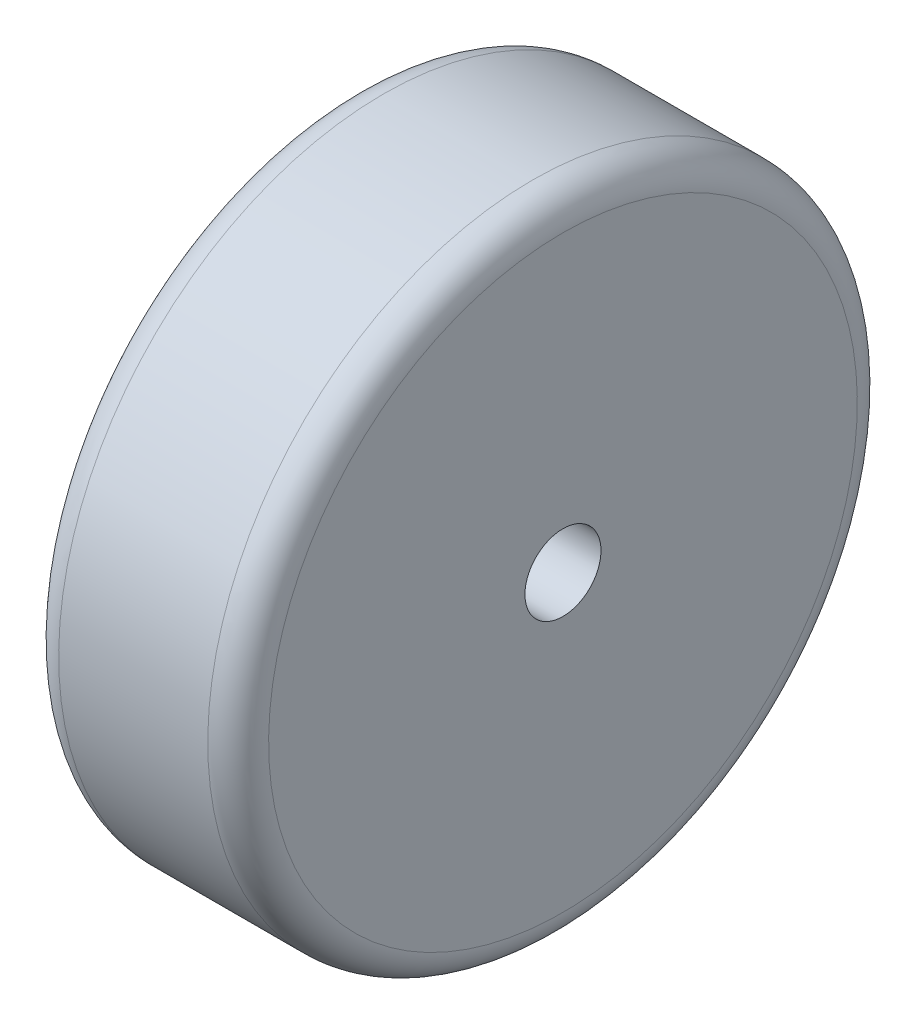
ISO-10303-21;
HEADER;
FILE_DESCRIPTION(('STEP AP214'),'2;1');
FILE_NAME('part.step','',(''),(''),'','','');
FILE_SCHEMA(('AUTOMOTIVE_DESIGN { 1 0 10303 214 1 1 1 1 }'));
ENDSEC;
DATA;
#1=APPLICATION_CONTEXT('core data for automotive mechanical design processes');
#2=APPLICATION_PROTOCOL_DEFINITION('international standard','automotive_design',2000,#1);
#3=PRODUCT_CONTEXT('',#1,'mechanical');
#4=PRODUCT('Part','Part','',(#3));
#5=PRODUCT_RELATED_PRODUCT_CATEGORY('part','',(#4));
#6=PRODUCT_DEFINITION_FORMATION('','',#4);
#7=PRODUCT_DEFINITION_CONTEXT('part definition',#1,'design');
#8=PRODUCT_DEFINITION('design','',#6,#7);
#9=PRODUCT_DEFINITION_SHAPE('','',#8);
#10=(LENGTH_UNIT() NAMED_UNIT(*) SI_UNIT(.MILLI.,.METRE.));
#11=(NAMED_UNIT(*) PLANE_ANGLE_UNIT() SI_UNIT($,.RADIAN.));
#12=(NAMED_UNIT(*) SI_UNIT($,.STERADIAN.) SOLID_ANGLE_UNIT());
#13=UNCERTAINTY_MEASURE_WITH_UNIT(LENGTH_MEASURE(1.E-05),#10,'distance_accuracy_value','');
#14=(GEOMETRIC_REPRESENTATION_CONTEXT(3) GLOBAL_UNCERTAINTY_ASSIGNED_CONTEXT((#13)) GLOBAL_UNIT_ASSIGNED_CONTEXT((#10,
#11,#12)) REPRESENTATION_CONTEXT('',''));
#15=CARTESIAN_POINT('',(0.,0.,0.));
#16=DIRECTION('',(0.,0.,1.));
#17=DIRECTION('',(1.,0.,0.));
#18=AXIS2_PLACEMENT_3D('',#15,#16,#17);
#19=CARTESIAN_POINT('',(11.8,0.,0.));
#20=DIRECTION('',(1.,0.,0.));
#21=DIRECTION('',(0.,1.,0.));
#22=AXIS2_PLACEMENT_3D('',#19,#20,#21);
#23=TOROIDAL_SURFACE('',#22,19.35,2.);
#24=CARTESIAN_POINT('',(13.8,0.,0.));
#25=DIRECTION('',(1.,0.,0.));
#26=DIRECTION('',(0.,1.,0.));
#27=AXIS2_PLACEMENT_3D('',#24,#25,#26);
#28=CIRCLE('',#27,19.35);
#29=CARTESIAN_POINT('',(13.8,19.35,0.));
#30=VERTEX_POINT('',#29);
#31=EDGE_CURVE('E57',#30,#30,#28,.T.);
#32=ORIENTED_EDGE('',*,*,#31,.F.);
#33=EDGE_LOOP('',(#32));
#34=FACE_BOUND('',#33,.T.);
#35=CARTESIAN_POINT('',(11.8,0.,0.));
#36=DIRECTION('',(-1.,0.,0.));
#37=DIRECTION('',(0.,1.,0.));
#38=AXIS2_PLACEMENT_3D('',#35,#36,#37);
#39=CIRCLE('',#38,21.35);
#40=CARTESIAN_POINT('',(11.8,21.35,0.));
#41=VERTEX_POINT('',#40);
#42=EDGE_CURVE('E10',#41,#41,#39,.T.);
#43=ORIENTED_EDGE('',*,*,#42,.F.);
#44=EDGE_LOOP('',(#43));
#45=FACE_BOUND('',#44,.T.);
#46=ADVANCED_FACE('F16',(#34,#45),#23,.T.);
#47=CARTESIAN_POINT('',(2.,0.,0.));
#48=DIRECTION('',(1.,0.,0.));
#49=DIRECTION('',(0.,1.,0.));
#50=AXIS2_PLACEMENT_3D('',#47,#48,#49);
#51=TOROIDAL_SURFACE('',#50,19.35,2.);
#52=CARTESIAN_POINT('',(2.,0.,0.));
#53=DIRECTION('',(1.,0.,0.));
#54=DIRECTION('',(0.,1.,0.));
#55=AXIS2_PLACEMENT_3D('',#52,#53,#54);
#56=CIRCLE('',#55,21.35);
#57=CARTESIAN_POINT('',(2.,21.35,0.));
#58=VERTEX_POINT('',#57);
#59=EDGE_CURVE('E24',#58,#58,#56,.T.);
#60=ORIENTED_EDGE('',*,*,#59,.F.);
#61=EDGE_LOOP('',(#60));
#62=FACE_BOUND('',#61,.T.);
#63=CARTESIAN_POINT('',(0.,0.,0.));
#64=DIRECTION('',(-1.,0.,0.));
#65=DIRECTION('',(0.,1.,0.));
#66=AXIS2_PLACEMENT_3D('',#63,#64,#65);
#67=CIRCLE('',#66,19.35);
#68=CARTESIAN_POINT('',(0.,19.35,0.));
#69=VERTEX_POINT('',#68);
#70=EDGE_CURVE('E66',#69,#69,#67,.T.);
#71=ORIENTED_EDGE('',*,*,#70,.F.);
#72=EDGE_LOOP('',(#71));
#73=FACE_BOUND('',#72,.T.);
#74=ADVANCED_FACE('F143',(#62,#73),#51,.T.);
#75=CARTESIAN_POINT('',(13.8,0.,0.));
#76=DIRECTION('',(-1.,0.,0.));
#77=DIRECTION('',(0.,-1.,0.));
#78=AXIS2_PLACEMENT_3D('',#75,#76,#77);
#79=CYLINDRICAL_SURFACE('',#78,2.5);
#80=CARTESIAN_POINT('',(0.,0.,0.));
#81=DIRECTION('',(1.,0.,0.));
#82=DIRECTION('',(0.,1.,0.));
#83=AXIS2_PLACEMENT_3D('',#80,#81,#82);
#84=CIRCLE('',#83,2.5);
#85=CARTESIAN_POINT('',(0.,2.5,0.));
#86=VERTEX_POINT('',#85);
#87=EDGE_CURVE('E69',#86,#86,#84,.T.);
#88=ORIENTED_EDGE('',*,*,#87,.F.);
#89=EDGE_LOOP('',(#88));
#90=FACE_BOUND('',#89,.T.);
#91=CARTESIAN_POINT('',(13.8,0.,0.));
#92=DIRECTION('',(1.,0.,0.));
#93=DIRECTION('',(0.,1.,0.));
#94=AXIS2_PLACEMENT_3D('',#91,#92,#93);
#95=CIRCLE('',#94,2.5);
#96=CARTESIAN_POINT('',(13.8,2.5,0.));
#97=VERTEX_POINT('',#96);
#98=EDGE_CURVE('E61',#97,#97,#95,.T.);
#99=ORIENTED_EDGE('',*,*,#98,.T.);
#100=EDGE_LOOP('',(#99));
#101=FACE_BOUND('',#100,.T.);
#102=ADVANCED_FACE('F133',(#90,#101),#79,.F.);
#103=CARTESIAN_POINT('',(13.8,0.,0.));
#104=DIRECTION('',(-1.,0.,0.));
#105=DIRECTION('',(0.,-1.,0.));
#106=AXIS2_PLACEMENT_3D('',#103,#104,#105);
#107=CYLINDRICAL_SURFACE('',#106,21.35);
#108=ORIENTED_EDGE('',*,*,#42,.T.);
#109=EDGE_LOOP('',(#108));
#110=FACE_BOUND('',#109,.T.);
#111=ORIENTED_EDGE('',*,*,#59,.T.);
#112=EDGE_LOOP('',(#111));
#113=FACE_BOUND('',#112,.T.);
#114=ADVANCED_FACE('F122',(#110,#113),#107,.T.);
#115=CARTESIAN_POINT('',(0.,0.,0.));
#116=DIRECTION('',(1.,0.,0.));
#117=DIRECTION('',(0.,1.,0.));
#118=AXIS2_PLACEMENT_3D('',#115,#116,#117);
#119=PLANE('',#118);
#120=ORIENTED_EDGE('',*,*,#87,.T.);
#121=EDGE_LOOP('',(#120));
#122=FACE_BOUND('',#121,.T.);
#123=ORIENTED_EDGE('',*,*,#70,.T.);
#124=EDGE_LOOP('',(#123));
#125=FACE_BOUND('',#124,.T.);
#126=ADVANCED_FACE('F110',(#122,#125),#119,.F.);
#127=CARTESIAN_POINT('',(13.8,0.,0.));
#128=DIRECTION('',(1.,0.,0.));
#129=DIRECTION('',(0.,1.,0.));
#130=AXIS2_PLACEMENT_3D('',#127,#128,#129);
#131=PLANE('',#130);
#132=ORIENTED_EDGE('',*,*,#98,.F.);
#133=EDGE_LOOP('',(#132));
#134=FACE_BOUND('',#133,.T.);
#135=ORIENTED_EDGE('',*,*,#31,.T.);
#136=EDGE_LOOP('',(#135));
#137=FACE_BOUND('',#136,.T.);
#138=ADVANCED_FACE('F58',(#134,#137),#131,.T.);
#139=CLOSED_SHELL('',(#46,#74,#102,#114,#126,#138));
#140=MANIFOLD_SOLID_BREP('B1',#139);
#141=ADVANCED_BREP_SHAPE_REPRESENTATION('',(#18,#140),#14);
#142=SHAPE_DEFINITION_REPRESENTATION(#9,#141);
ENDSEC;
END-ISO-10303-21;
